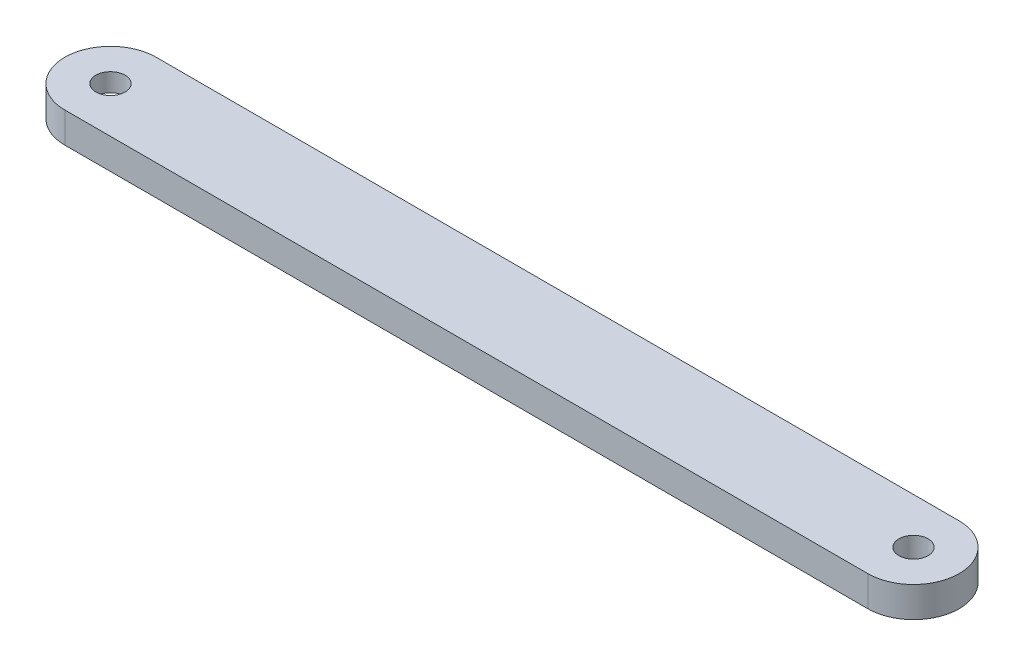
ISO-10303-21;
HEADER;
FILE_DESCRIPTION(('STEP AP214'),'2;1');
FILE_NAME('part.step','',(''),(''),'','','');
FILE_SCHEMA(('AUTOMOTIVE_DESIGN { 1 0 10303 214 1 1 1 1 }'));
ENDSEC;
DATA;
#1=APPLICATION_CONTEXT('core data for automotive mechanical design processes');
#2=APPLICATION_PROTOCOL_DEFINITION('international standard','automotive_design',2000,#1);
#3=PRODUCT_CONTEXT('',#1,'mechanical');
#4=PRODUCT('Part','Part','',(#3));
#5=PRODUCT_RELATED_PRODUCT_CATEGORY('part','',(#4));
#6=PRODUCT_DEFINITION_FORMATION('','',#4);
#7=PRODUCT_DEFINITION_CONTEXT('part definition',#1,'design');
#8=PRODUCT_DEFINITION('design','',#6,#7);
#9=PRODUCT_DEFINITION_SHAPE('','',#8);
#10=(LENGTH_UNIT() NAMED_UNIT(*) SI_UNIT(.MILLI.,.METRE.));
#11=(NAMED_UNIT(*) PLANE_ANGLE_UNIT() SI_UNIT($,.RADIAN.));
#12=(NAMED_UNIT(*) SI_UNIT($,.STERADIAN.) SOLID_ANGLE_UNIT());
#13=UNCERTAINTY_MEASURE_WITH_UNIT(LENGTH_MEASURE(1.E-05),#10,'distance_accuracy_value','');
#14=(GEOMETRIC_REPRESENTATION_CONTEXT(3) GLOBAL_UNCERTAINTY_ASSIGNED_CONTEXT((#13)) GLOBAL_UNIT_ASSIGNED_CONTEXT((#10,
#11,#12)) REPRESENTATION_CONTEXT('',''));
#15=CARTESIAN_POINT('',(0.,0.,0.));
#16=DIRECTION('',(0.,0.,1.));
#17=DIRECTION('',(1.,0.,0.));
#18=AXIS2_PLACEMENT_3D('',#15,#16,#17);
#19=CARTESIAN_POINT('',(-168.430003274143,4.50526087608301,0.));
#20=DIRECTION('',(0.,-1.,0.));
#21=DIRECTION('',(0.,0.,-1.));
#22=AXIS2_PLACEMENT_3D('',#19,#20,#21);
#23=CYLINDRICAL_SURFACE('',#22,1.92);
#24=CARTESIAN_POINT('',(-168.430003274143,4.50526087608301,0.));
#25=DIRECTION('',(0.,1.,0.));
#26=DIRECTION('',(0.,0.,1.));
#27=AXIS2_PLACEMENT_3D('',#24,#25,#26);
#28=CIRCLE('',#27,1.92);
#29=CARTESIAN_POINT('',(-168.430003274143,4.50526087608301,1.92));
#30=VERTEX_POINT('',#29);
#31=EDGE_CURVE('E120',#30,#30,#28,.T.);
#32=ORIENTED_EDGE('',*,*,#31,.T.);
#33=EDGE_LOOP('',(#32));
#34=FACE_BOUND('',#33,.T.);
#35=CARTESIAN_POINT('',(-168.430003274143,2.10526087608301,0.));
#36=DIRECTION('',(0.,-1.,0.));
#37=DIRECTION('',(0.,0.,-1.));
#38=AXIS2_PLACEMENT_3D('',#35,#36,#37);
#39=CIRCLE('',#38,1.92);
#40=CARTESIAN_POINT('',(-168.430003274143,2.10526087608301,-1.92));
#41=VERTEX_POINT('',#40);
#42=EDGE_CURVE('E48',#41,#41,#39,.T.);
#43=ORIENTED_EDGE('',*,*,#42,.T.);
#44=EDGE_LOOP('',(#43));
#45=FACE_BOUND('',#44,.T.);
#46=ADVANCED_FACE('F44',(#34,#45),#23,.F.);
#47=CARTESIAN_POINT('',(-168.430003274143,4.50526087608301,0.));
#48=DIRECTION('',(0.,1.,0.));
#49=DIRECTION('',(0.,0.,1.));
#50=AXIS2_PLACEMENT_3D('',#47,#48,#49);
#51=PLANE('',#50);
#52=ORIENTED_EDGE('',*,*,#31,.F.);
#53=EDGE_LOOP('',(#52));
#54=FACE_BOUND('',#53,.T.);
#55=CARTESIAN_POINT('',(-168.430003274143,4.50526087608301,0.));
#56=DIRECTION('',(0.,1.,0.));
#57=DIRECTION('',(0.,0.,1.));
#58=AXIS2_PLACEMENT_3D('',#55,#56,#57);
#59=CIRCLE('',#58,6.);
#60=CARTESIAN_POINT('',(-168.430003274143,4.50526087608301,-6.));
#61=VERTEX_POINT('',#60);
#62=CARTESIAN_POINT('',(-168.430003274143,4.50526087608301,6.));
#63=VERTEX_POINT('',#62);
#64=EDGE_CURVE('E99',#61,#63,#59,.T.);
#65=ORIENTED_EDGE('',*,*,#64,.T.);
#66=DIRECTION('',(1.,0.,0.));
#67=VECTOR('',#66,1.);
#68=CARTESIAN_POINT('',(-168.430003274143,4.50526087608301,6.));
#69=LINE('',#68,#67);
#70=CARTESIAN_POINT('',(-62.9533709221428,4.50526087608301,5.99999999999999));
#71=VERTEX_POINT('',#70);
#72=EDGE_CURVE('E93',#63,#71,#69,.T.);
#73=ORIENTED_EDGE('',*,*,#72,.T.);
#74=CARTESIAN_POINT('',(-62.9533709221428,4.50526087608301,0.));
#75=DIRECTION('',(0.,1.,0.));
#76=DIRECTION('',(0.,0.,1.));
#77=AXIS2_PLACEMENT_3D('',#74,#75,#76);
#78=CIRCLE('',#77,6.);
#79=CARTESIAN_POINT('',(-62.9533709221428,4.50526087608301,-6.00000000000001));
#80=VERTEX_POINT('',#79);
#81=EDGE_CURVE('E97',#71,#80,#78,.T.);
#82=ORIENTED_EDGE('',*,*,#81,.T.);
#83=DIRECTION('',(-1.,0.,0.));
#84=VECTOR('',#83,1.);
#85=CARTESIAN_POINT('',(-168.430003274143,4.50526087608301,-6.));
#86=LINE('',#85,#84);
#87=EDGE_CURVE('E63',#80,#61,#86,.T.);
#88=ORIENTED_EDGE('',*,*,#87,.T.);
#89=EDGE_LOOP('',(#65,#73,#82,#88));
#90=FACE_BOUND('',#89,.T.);
#91=CARTESIAN_POINT('',(-62.9533709221428,4.50526087608301,0.));
#92=DIRECTION('',(0.,1.,0.));
#93=DIRECTION('',(0.,0.,1.));
#94=AXIS2_PLACEMENT_3D('',#91,#92,#93);
#95=CIRCLE('',#94,1.92);
#96=CARTESIAN_POINT('',(-62.9533709221428,4.50526087608301,1.91999999999999));
#97=VERTEX_POINT('',#96);
#98=EDGE_CURVE('E141',#97,#97,#95,.T.);
#99=ORIENTED_EDGE('',*,*,#98,.F.);
#100=EDGE_LOOP('',(#99));
#101=FACE_BOUND('',#100,.T.);
#102=ADVANCED_FACE('F94',(#54,#90,#101),#51,.T.);
#103=CARTESIAN_POINT('',(-168.430003274143,0.505260876083012,0.));
#104=DIRECTION('',(0.,1.,0.));
#105=DIRECTION('',(0.,0.,1.));
#106=AXIS2_PLACEMENT_3D('',#103,#104,#105);
#107=PLANE('',#106);
#108=CARTESIAN_POINT('',(-168.430003274143,0.505260876083012,0.));
#109=DIRECTION('',(0.,-1.,0.));
#110=DIRECTION('',(0.,0.,-1.));
#111=AXIS2_PLACEMENT_3D('',#108,#109,#110);
#112=CIRCLE('',#111,4.72);
#113=CARTESIAN_POINT('',(-168.430003274143,0.505260876083012,-4.72));
#114=VERTEX_POINT('',#113);
#115=EDGE_CURVE('E149',#114,#114,#112,.T.);
#116=ORIENTED_EDGE('',*,*,#115,.F.);
#117=EDGE_LOOP('',(#116));
#118=FACE_BOUND('',#117,.T.);
#119=CARTESIAN_POINT('',(-168.430003274143,0.505260876083012,0.));
#120=DIRECTION('',(0.,1.,0.));
#121=DIRECTION('',(0.,0.,1.));
#122=AXIS2_PLACEMENT_3D('',#119,#120,#121);
#123=CIRCLE('',#122,6.);
#124=CARTESIAN_POINT('',(-168.430003274143,0.505260876083012,-6.));
#125=VERTEX_POINT('',#124);
#126=CARTESIAN_POINT('',(-168.430003274143,0.505260876083012,6.));
#127=VERTEX_POINT('',#126);
#128=EDGE_CURVE('E116',#125,#127,#123,.T.);
#129=ORIENTED_EDGE('',*,*,#128,.F.);
#130=DIRECTION('',(-1.,0.,0.));
#131=VECTOR('',#130,1.);
#132=CARTESIAN_POINT('',(-168.430003274143,0.505260876083012,-6.));
#133=LINE('',#132,#131);
#134=CARTESIAN_POINT('',(-62.9533709221428,0.505260876083012,-6.00000000000001));
#135=VERTEX_POINT('',#134);
#136=EDGE_CURVE('E86',#135,#125,#133,.T.);
#137=ORIENTED_EDGE('',*,*,#136,.F.);
#138=CARTESIAN_POINT('',(-62.9533709221428,0.505260876083012,0.));
#139=DIRECTION('',(0.,1.,0.));
#140=DIRECTION('',(0.,0.,1.));
#141=AXIS2_PLACEMENT_3D('',#138,#139,#140);
#142=CIRCLE('',#141,6.);
#143=CARTESIAN_POINT('',(-62.9533709221428,0.505260876083012,5.99999999999999));
#144=VERTEX_POINT('',#143);
#145=EDGE_CURVE('E80',#144,#135,#142,.T.);
#146=ORIENTED_EDGE('',*,*,#145,.F.);
#147=DIRECTION('',(1.,0.,0.));
#148=VECTOR('',#147,1.);
#149=CARTESIAN_POINT('',(-168.430003274143,0.505260876083012,6.));
#150=LINE('',#149,#148);
#151=EDGE_CURVE('E104',#127,#144,#150,.T.);
#152=ORIENTED_EDGE('',*,*,#151,.F.);
#153=EDGE_LOOP('',(#129,#137,#146,#152));
#154=FACE_BOUND('',#153,.T.);
#155=CARTESIAN_POINT('',(-62.9533709221428,0.505260876083012,0.));
#156=DIRECTION('',(0.,1.,0.));
#157=DIRECTION('',(0.,0.,1.));
#158=AXIS2_PLACEMENT_3D('',#155,#156,#157);
#159=CIRCLE('',#158,1.92);
#160=CARTESIAN_POINT('',(-62.9533709221428,0.505260876083012,1.91999999999999));
#161=VERTEX_POINT('',#160);
#162=EDGE_CURVE('E142',#161,#161,#159,.T.);
#163=ORIENTED_EDGE('',*,*,#162,.T.);
#164=EDGE_LOOP('',(#163));
#165=FACE_BOUND('',#164,.T.);
#166=ADVANCED_FACE('F133',(#118,#154,#165),#107,.F.);
#167=CARTESIAN_POINT('',(-168.430003274143,4.50526087608301,0.));
#168=DIRECTION('',(0.,-1.,0.));
#169=DIRECTION('',(0.,0.,-1.));
#170=AXIS2_PLACEMENT_3D('',#167,#168,#169);
#171=CYLINDRICAL_SURFACE('',#170,6.);
#172=ORIENTED_EDGE('',*,*,#128,.T.);
#173=DIRECTION('',(0.,-1.,0.));
#174=VECTOR('',#173,1.);
#175=CARTESIAN_POINT('',(-168.430003274143,4.50526087608301,6.));
#176=LINE('',#175,#174);
#177=EDGE_CURVE('E11',#63,#127,#176,.T.);
#178=ORIENTED_EDGE('',*,*,#177,.F.);
#179=ORIENTED_EDGE('',*,*,#64,.F.);
#180=DIRECTION('',(0.,-1.,0.));
#181=VECTOR('',#180,1.);
#182=CARTESIAN_POINT('',(-168.430003274143,4.50526087608301,-6.));
#183=LINE('',#182,#181);
#184=EDGE_CURVE('E112',#61,#125,#183,.T.);
#185=ORIENTED_EDGE('',*,*,#184,.T.);
#186=EDGE_LOOP('',(#172,#178,#179,#185));
#187=FACE_BOUND('',#186,.T.);
#188=ADVANCED_FACE('F46',(#187),#171,.T.);
#189=CARTESIAN_POINT('',(-168.430003274143,4.50526087608301,6.));
#190=DIRECTION('',(0.,0.,-1.));
#191=DIRECTION('',(-1.,0.,0.));
#192=AXIS2_PLACEMENT_3D('',#189,#190,#191);
#193=PLANE('',#192);
#194=ORIENTED_EDGE('',*,*,#151,.T.);
#195=DIRECTION('',(0.,-1.,0.));
#196=VECTOR('',#195,1.);
#197=CARTESIAN_POINT('',(-62.9533709221428,4.50526087608301,5.99999999999999));
#198=LINE('',#197,#196);
#199=EDGE_CURVE('E55',#71,#144,#198,.T.);
#200=ORIENTED_EDGE('',*,*,#199,.F.);
#201=ORIENTED_EDGE('',*,*,#72,.F.);
#202=ORIENTED_EDGE('',*,*,#177,.T.);
#203=EDGE_LOOP('',(#194,#200,#201,#202));
#204=FACE_BOUND('',#203,.T.);
#205=ADVANCED_FACE('F103',(#204),#193,.F.);
#206=CARTESIAN_POINT('',(-62.9533709221428,4.50526087608301,0.));
#207=DIRECTION('',(0.,-1.,0.));
#208=DIRECTION('',(0.,0.,-1.));
#209=AXIS2_PLACEMENT_3D('',#206,#207,#208);
#210=CYLINDRICAL_SURFACE('',#209,6.);
#211=ORIENTED_EDGE('',*,*,#145,.T.);
#212=DIRECTION('',(0.,-1.,0.));
#213=VECTOR('',#212,1.);
#214=CARTESIAN_POINT('',(-62.9533709221428,4.50526087608301,-6.00000000000001));
#215=LINE('',#214,#213);
#216=EDGE_CURVE('E106',#80,#135,#215,.T.);
#217=ORIENTED_EDGE('',*,*,#216,.F.);
#218=ORIENTED_EDGE('',*,*,#81,.F.);
#219=ORIENTED_EDGE('',*,*,#199,.T.);
#220=EDGE_LOOP('',(#211,#217,#218,#219));
#221=FACE_BOUND('',#220,.T.);
#222=ADVANCED_FACE('F108',(#221),#210,.T.);
#223=CARTESIAN_POINT('',(-168.430003274143,4.50526087608301,-6.));
#224=DIRECTION('',(0.,0.,1.));
#225=DIRECTION('',(1.,0.,0.));
#226=AXIS2_PLACEMENT_3D('',#223,#224,#225);
#227=PLANE('',#226);
#228=ORIENTED_EDGE('',*,*,#136,.T.);
#229=ORIENTED_EDGE('',*,*,#184,.F.);
#230=ORIENTED_EDGE('',*,*,#87,.F.);
#231=ORIENTED_EDGE('',*,*,#216,.T.);
#232=EDGE_LOOP('',(#228,#229,#230,#231));
#233=FACE_BOUND('',#232,.T.);
#234=ADVANCED_FACE('F130',(#233),#227,.F.);
#235=CARTESIAN_POINT('',(-62.9533709221428,4.50526087608301,0.));
#236=DIRECTION('',(0.,-1.,0.));
#237=DIRECTION('',(0.,0.,-1.));
#238=AXIS2_PLACEMENT_3D('',#235,#236,#237);
#239=CYLINDRICAL_SURFACE('',#238,1.92);
#240=ORIENTED_EDGE('',*,*,#98,.T.);
#241=EDGE_LOOP('',(#240));
#242=FACE_BOUND('',#241,.T.);
#243=ORIENTED_EDGE('',*,*,#162,.F.);
#244=EDGE_LOOP('',(#243));
#245=FACE_BOUND('',#244,.T.);
#246=ADVANCED_FACE('F170',(#242,#245),#239,.F.);
#247=CARTESIAN_POINT('',(-168.430003274143,2.10526087608301,0.));
#248=DIRECTION('',(0.,-1.,0.));
#249=DIRECTION('',(0.,0.,-1.));
#250=AXIS2_PLACEMENT_3D('',#247,#248,#249);
#251=CYLINDRICAL_SURFACE('',#250,4.72);
#252=CARTESIAN_POINT('',(-168.430003274143,2.10526087608301,0.));
#253=DIRECTION('',(0.,-1.,0.));
#254=DIRECTION('',(0.,0.,-1.));
#255=AXIS2_PLACEMENT_3D('',#252,#253,#254);
#256=CIRCLE('',#255,4.72);
#257=CARTESIAN_POINT('',(-168.430003274143,2.10526087608301,-4.72));
#258=VERTEX_POINT('',#257);
#259=EDGE_CURVE('E153',#258,#258,#256,.T.);
#260=ORIENTED_EDGE('',*,*,#259,.F.);
#261=EDGE_LOOP('',(#260));
#262=FACE_BOUND('',#261,.T.);
#263=ORIENTED_EDGE('',*,*,#115,.T.);
#264=EDGE_LOOP('',(#263));
#265=FACE_BOUND('',#264,.T.);
#266=ADVANCED_FACE('F165',(#262,#265),#251,.F.);
#267=CARTESIAN_POINT('',(-168.430003274143,2.10526087608301,0.));
#268=DIRECTION('',(0.,-1.,0.));
#269=DIRECTION('',(0.,0.,-1.));
#270=AXIS2_PLACEMENT_3D('',#267,#268,#269);
#271=PLANE('',#270);
#272=ORIENTED_EDGE('',*,*,#42,.F.);
#273=EDGE_LOOP('',(#272));
#274=FACE_BOUND('',#273,.T.);
#275=ORIENTED_EDGE('',*,*,#259,.T.);
#276=EDGE_LOOP('',(#275));
#277=FACE_BOUND('',#276,.T.);
#278=ADVANCED_FACE('F163',(#274,#277),#271,.T.);
#279=CLOSED_SHELL('',(#46,#102,#166,#188,#205,#222,#234,#246,#266,#278));
#280=MANIFOLD_SOLID_BREP('B2',#279);
#281=ADVANCED_BREP_SHAPE_REPRESENTATION('',(#18,#280),#14);
#282=SHAPE_DEFINITION_REPRESENTATION(#9,#281);
ENDSEC;
END-ISO-10303-21;
